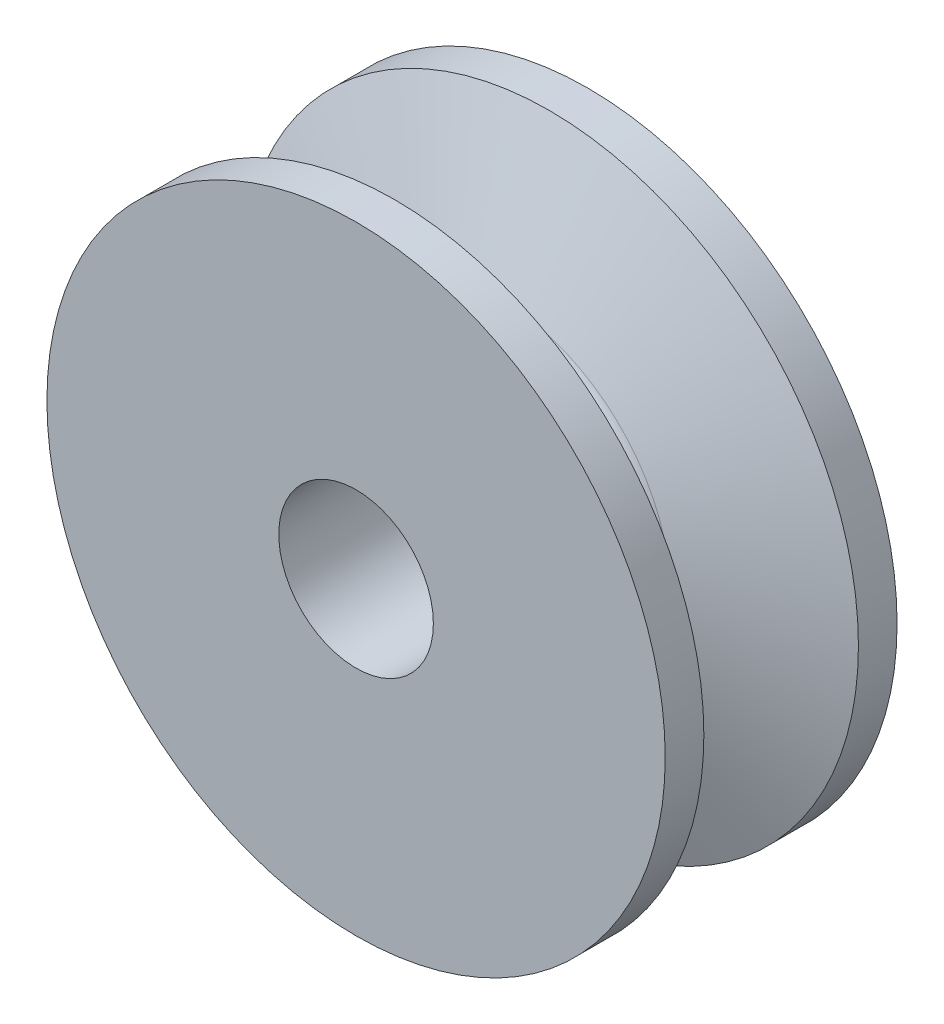
ISO-10303-21;
HEADER;
FILE_DESCRIPTION(('STEP AP214'),'2;1');
FILE_NAME('part.step','',(''),(''),'','','');
FILE_SCHEMA(('AUTOMOTIVE_DESIGN { 1 0 10303 214 1 1 1 1 }'));
ENDSEC;
DATA;
#1=APPLICATION_CONTEXT('core data for automotive mechanical design processes');
#2=APPLICATION_PROTOCOL_DEFINITION('international standard','automotive_design',2000,#1);
#3=PRODUCT_CONTEXT('',#1,'mechanical');
#4=PRODUCT('Part','Part','',(#3));
#5=PRODUCT_RELATED_PRODUCT_CATEGORY('part','',(#4));
#6=PRODUCT_DEFINITION_FORMATION('','',#4);
#7=PRODUCT_DEFINITION_CONTEXT('part definition',#1,'design');
#8=PRODUCT_DEFINITION('design','',#6,#7);
#9=PRODUCT_DEFINITION_SHAPE('','',#8);
#10=(LENGTH_UNIT() NAMED_UNIT(*) SI_UNIT(.MILLI.,.METRE.));
#11=(NAMED_UNIT(*) PLANE_ANGLE_UNIT() SI_UNIT($,.RADIAN.));
#12=(NAMED_UNIT(*) SI_UNIT($,.STERADIAN.) SOLID_ANGLE_UNIT());
#13=UNCERTAINTY_MEASURE_WITH_UNIT(LENGTH_MEASURE(1.E-05),#10,'distance_accuracy_value','');
#14=(GEOMETRIC_REPRESENTATION_CONTEXT(3) GLOBAL_UNCERTAINTY_ASSIGNED_CONTEXT((#13)) GLOBAL_UNIT_ASSIGNED_CONTEXT((#10,
#11,#12)) REPRESENTATION_CONTEXT('',''));
#15=CARTESIAN_POINT('',(0.,0.,0.));
#16=DIRECTION('',(0.,0.,1.));
#17=DIRECTION('',(1.,0.,0.));
#18=AXIS2_PLACEMENT_3D('',#15,#16,#17);
#19=CARTESIAN_POINT('',(0.,0.,7.5));
#20=DIRECTION('',(0.,0.,-1.));
#21=DIRECTION('',(-1.,0.,0.));
#22=AXIS2_PLACEMENT_3D('',#19,#20,#21);
#23=CYLINDRICAL_SURFACE('',#22,20.);
#24=CARTESIAN_POINT('',(0.,0.,7.5));
#25=DIRECTION('',(0.,0.,1.));
#26=DIRECTION('',(1.,0.,0.));
#27=AXIS2_PLACEMENT_3D('',#24,#25,#26);
#28=CIRCLE('',#27,20.);
#29=CARTESIAN_POINT('',(20.,0.,7.5));
#30=VERTEX_POINT('',#29);
#31=EDGE_CURVE('E52',#30,#30,#28,.T.);
#32=ORIENTED_EDGE('',*,*,#31,.F.);
#33=EDGE_LOOP('',(#32));
#34=FACE_BOUND('',#33,.T.);
#35=CARTESIAN_POINT('',(0.,0.,5.));
#36=DIRECTION('',(0.,0.,1.));
#37=DIRECTION('',(1.,0.,0.));
#38=AXIS2_PLACEMENT_3D('',#35,#36,#37);
#39=CIRCLE('',#38,20.);
#40=CARTESIAN_POINT('',(20.,0.,5.));
#41=VERTEX_POINT('',#40);
#42=EDGE_CURVE('E56',#41,#41,#39,.T.);
#43=ORIENTED_EDGE('',*,*,#42,.T.);
#44=EDGE_LOOP('',(#43));
#45=FACE_BOUND('',#44,.T.);
#46=ADVANCED_FACE('F32',(#34,#45),#23,.T.);
#47=CARTESIAN_POINT('',(0.,0.,7.5));
#48=DIRECTION('',(0.,0.,1.));
#49=DIRECTION('',(1.,0.,0.));
#50=AXIS2_PLACEMENT_3D('',#47,#48,#49);
#51=PLANE('',#50);
#52=CARTESIAN_POINT('',(0.,0.,7.5));
#53=DIRECTION('',(0.,0.,1.));
#54=DIRECTION('',(1.,0.,0.));
#55=AXIS2_PLACEMENT_3D('',#52,#53,#54);
#56=CIRCLE('',#55,5.);
#57=CARTESIAN_POINT('',(5.,0.,7.5));
#58=VERTEX_POINT('',#57);
#59=EDGE_CURVE('E65',#58,#58,#56,.T.);
#60=ORIENTED_EDGE('',*,*,#59,.F.);
#61=EDGE_LOOP('',(#60));
#62=FACE_BOUND('',#61,.T.);
#63=ORIENTED_EDGE('',*,*,#31,.T.);
#64=EDGE_LOOP('',(#63));
#65=FACE_BOUND('',#64,.T.);
#66=ADVANCED_FACE('F80',(#62,#65),#51,.T.);
#67=CARTESIAN_POINT('',(0.,0.,5.));
#68=DIRECTION('',(0.,0.,1.));
#69=DIRECTION('',(1.,0.,0.));
#70=AXIS2_PLACEMENT_3D('',#67,#68,#69);
#71=CONICAL_SURFACE('',#70,20.,1.21861155690498);
#72=CARTESIAN_POINT('',(0.,0.,1.73418644074159));
#73=DIRECTION('',(0.,0.,1.));
#74=DIRECTION('',(1.,0.,0.));
#75=AXIS2_PLACEMENT_3D('',#72,#73,#74);
#76=CIRCLE('',#75,11.1135861888469);
#77=CARTESIAN_POINT('',(11.1135861888469,0.,1.73418644074159));
#78=VERTEX_POINT('',#77);
#79=EDGE_CURVE('E39',#78,#78,#76,.T.);
#80=ORIENTED_EDGE('',*,*,#79,.T.);
#81=EDGE_LOOP('',(#80));
#82=FACE_BOUND('',#81,.T.);
#83=ORIENTED_EDGE('',*,*,#42,.F.);
#84=EDGE_LOOP('',(#83));
#85=FACE_BOUND('',#84,.T.);
#86=ADVANCED_FACE('F83',(#82,#85),#71,.T.);
#87=CARTESIAN_POINT('',(0.,0.,15.7885726147612));
#88=DIRECTION('',(0.,0.,1.));
#89=DIRECTION('',(1.,0.,0.));
#90=AXIS2_PLACEMENT_3D('',#87,#88,#89);
#91=CYLINDRICAL_SURFACE('',#90,10.);
#92=CARTESIAN_POINT('',(0.,0.,0.138530198912253));
#93=DIRECTION('',(0.,0.,1.));
#94=DIRECTION('',(1.,0.,0.));
#95=AXIS2_PLACEMENT_3D('',#92,#93,#94);
#96=CIRCLE('',#95,10.);
#97=CARTESIAN_POINT('',(10.,0.,0.138530198912253));
#98=VERTEX_POINT('',#97);
#99=EDGE_CURVE('E10',#98,#98,#96,.F.);
#100=ORIENTED_EDGE('',*,*,#99,.T.);
#101=EDGE_LOOP('',(#100));
#102=FACE_BOUND('',#101,.T.);
#103=CARTESIAN_POINT('',(0.,0.,-0.138530198912256));
#104=DIRECTION('',(0.,0.,1.));
#105=DIRECTION('',(1.,0.,0.));
#106=AXIS2_PLACEMENT_3D('',#103,#104,#105);
#107=CIRCLE('',#106,10.);
#108=CARTESIAN_POINT('',(10.,0.,-0.138530198912256));
#109=VERTEX_POINT('',#108);
#110=EDGE_CURVE('E47',#109,#109,#107,.T.);
#111=ORIENTED_EDGE('',*,*,#110,.T.);
#112=EDGE_LOOP('',(#111));
#113=FACE_BOUND('',#112,.T.);
#114=ADVANCED_FACE('F94',(#102,#113),#91,.T.);
#115=CARTESIAN_POINT('',(0.,0.,-1.32493643818434));
#116=DIRECTION('',(0.,0.,-1.));
#117=DIRECTION('',(-1.,0.,0.));
#118=AXIS2_PLACEMENT_3D('',#115,#116,#117);
#119=CONICAL_SURFACE('',#118,10.,1.21861155690498);
#120=CARTESIAN_POINT('',(0.,0.,-1.73418644074159));
#121=DIRECTION('',(0.,0.,-1.));
#122=DIRECTION('',(-1.,0.,0.));
#123=AXIS2_PLACEMENT_3D('',#120,#121,#122);
#124=CIRCLE('',#123,11.1135861888469);
#125=CARTESIAN_POINT('',(-11.1135861888469,0.,-1.73418644074159));
#126=VERTEX_POINT('',#125);
#127=EDGE_CURVE('E43',#126,#126,#124,.T.);
#128=ORIENTED_EDGE('',*,*,#127,.T.);
#129=EDGE_LOOP('',(#128));
#130=FACE_BOUND('',#129,.T.);
#131=CARTESIAN_POINT('',(0.,0.,-5.));
#132=DIRECTION('',(0.,0.,1.));
#133=DIRECTION('',(1.,0.,0.));
#134=AXIS2_PLACEMENT_3D('',#131,#132,#133);
#135=CIRCLE('',#134,20.);
#136=CARTESIAN_POINT('',(20.,0.,-5.));
#137=VERTEX_POINT('',#136);
#138=EDGE_CURVE('E61',#137,#137,#135,.T.);
#139=ORIENTED_EDGE('',*,*,#138,.T.);
#140=EDGE_LOOP('',(#139));
#141=FACE_BOUND('',#140,.T.);
#142=ADVANCED_FACE('F99',(#130,#141),#119,.T.);
#143=CARTESIAN_POINT('',(0.,0.,-7.5));
#144=DIRECTION('',(0.,0.,1.));
#145=DIRECTION('',(1.,0.,0.));
#146=AXIS2_PLACEMENT_3D('',#143,#144,#145);
#147=PLANE('',#146);
#148=CARTESIAN_POINT('',(0.,0.,-7.5));
#149=DIRECTION('',(0.,0.,1.));
#150=DIRECTION('',(1.,0.,0.));
#151=AXIS2_PLACEMENT_3D('',#148,#149,#150);
#152=CIRCLE('',#151,5.);
#153=CARTESIAN_POINT('',(5.,0.,-7.5));
#154=VERTEX_POINT('',#153);
#155=EDGE_CURVE('E64',#154,#154,#152,.T.);
#156=ORIENTED_EDGE('',*,*,#155,.T.);
#157=EDGE_LOOP('',(#156));
#158=FACE_BOUND('',#157,.T.);
#159=CARTESIAN_POINT('',(0.,0.,-7.5));
#160=DIRECTION('',(0.,0.,1.));
#161=DIRECTION('',(1.,0.,0.));
#162=AXIS2_PLACEMENT_3D('',#159,#160,#161);
#163=CIRCLE('',#162,20.);
#164=CARTESIAN_POINT('',(20.,0.,-7.5));
#165=VERTEX_POINT('',#164);
#166=EDGE_CURVE('E53',#165,#165,#163,.T.);
#167=ORIENTED_EDGE('',*,*,#166,.F.);
#168=EDGE_LOOP('',(#167));
#169=FACE_BOUND('',#168,.T.);
#170=ADVANCED_FACE('F71',(#158,#169),#147,.F.);
#171=ORIENTED_EDGE('',*,*,#166,.T.);
#172=EDGE_LOOP('',(#171));
#173=FACE_BOUND('',#172,.T.);
#174=ORIENTED_EDGE('',*,*,#138,.F.);
#175=EDGE_LOOP('',(#174));
#176=FACE_BOUND('',#175,.T.);
#177=ADVANCED_FACE('F90',(#173,#176),#23,.T.);
#178=CARTESIAN_POINT('',(0.,0.,-0.138530198912255));
#179=DIRECTION('',(0.,0.,1.));
#180=DIRECTION('',(1.,0.,0.));
#181=AXIS2_PLACEMENT_3D('',#178,#179,#180);
#182=TOROIDAL_SURFACE('',#181,11.7,1.7);
#183=ORIENTED_EDGE('',*,*,#127,.F.);
#184=EDGE_LOOP('',(#183));
#185=FACE_BOUND('',#184,.T.);
#186=ORIENTED_EDGE('',*,*,#110,.F.);
#187=EDGE_LOOP('',(#186));
#188=FACE_BOUND('',#187,.T.);
#189=ADVANCED_FACE('F104',(#185,#188),#182,.F.);
#190=CARTESIAN_POINT('',(0.,0.,0.138530198912253));
#191=DIRECTION('',(0.,0.,1.));
#192=DIRECTION('',(1.,0.,0.));
#193=AXIS2_PLACEMENT_3D('',#190,#191,#192);
#194=TOROIDAL_SURFACE('',#193,11.7,1.7);
#195=ORIENTED_EDGE('',*,*,#99,.F.);
#196=EDGE_LOOP('',(#195));
#197=FACE_BOUND('',#196,.T.);
#198=ORIENTED_EDGE('',*,*,#79,.F.);
#199=EDGE_LOOP('',(#198));
#200=FACE_BOUND('',#199,.T.);
#201=ADVANCED_FACE('F34',(#197,#200),#194,.F.);
#202=CARTESIAN_POINT('',(0.,0.,-7.5));
#203=DIRECTION('',(0.,0.,1.));
#204=DIRECTION('',(1.,0.,0.));
#205=AXIS2_PLACEMENT_3D('',#202,#203,#204);
#206=CYLINDRICAL_SURFACE('',#205,5.);
#207=ORIENTED_EDGE('',*,*,#155,.F.);
#208=EDGE_LOOP('',(#207));
#209=FACE_BOUND('',#208,.T.);
#210=ORIENTED_EDGE('',*,*,#59,.T.);
#211=EDGE_LOOP('',(#210));
#212=FACE_BOUND('',#211,.T.);
#213=ADVANCED_FACE('F74',(#209,#212),#206,.F.);
#214=CLOSED_SHELL('',(#46,#66,#86,#114,#142,#170,#177,#189,#201,#213));
#215=MANIFOLD_SOLID_BREP('B2',#214);
#216=ADVANCED_BREP_SHAPE_REPRESENTATION('',(#18,#215),#14);
#217=SHAPE_DEFINITION_REPRESENTATION(#9,#216);
ENDSEC;
END-ISO-10303-21;
